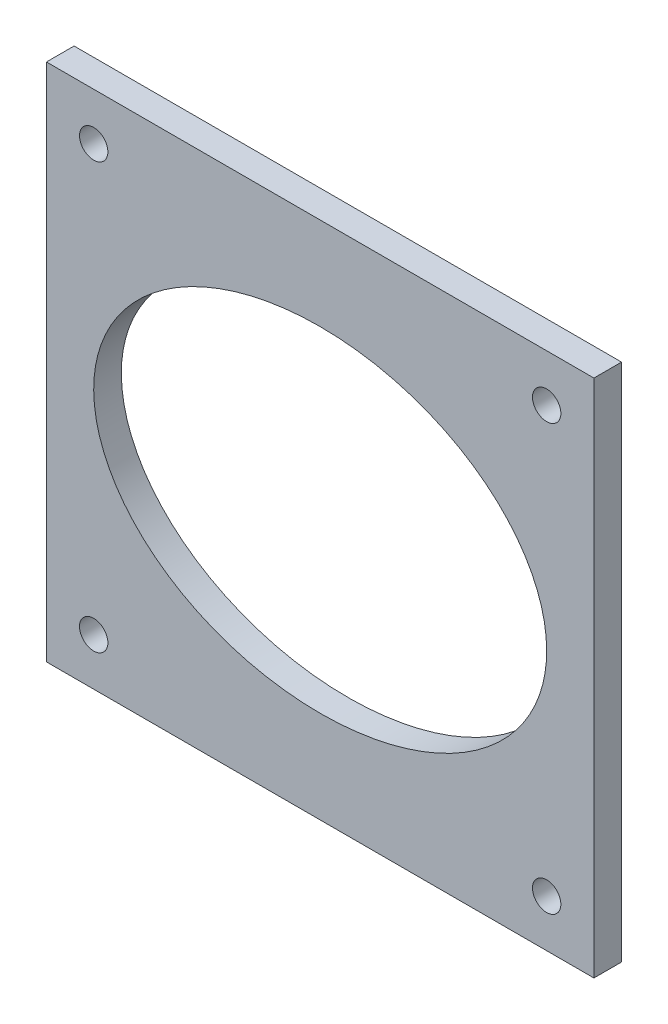
ISO-10303-21;
HEADER;
FILE_DESCRIPTION(('STEP AP214'),'2;1');
FILE_NAME('part.step','',(''),(''),'','','');
FILE_SCHEMA(('AUTOMOTIVE_DESIGN { 1 0 10303 214 1 1 1 1 }'));
ENDSEC;
DATA;
#1=APPLICATION_CONTEXT('core data for automotive mechanical design processes');
#2=APPLICATION_PROTOCOL_DEFINITION('international standard','automotive_design',2000,#1);
#3=PRODUCT_CONTEXT('',#1,'mechanical');
#4=PRODUCT('Part','Part','',(#3));
#5=PRODUCT_RELATED_PRODUCT_CATEGORY('part','',(#4));
#6=PRODUCT_DEFINITION_FORMATION('','',#4);
#7=PRODUCT_DEFINITION_CONTEXT('part definition',#1,'design');
#8=PRODUCT_DEFINITION('design','',#6,#7);
#9=PRODUCT_DEFINITION_SHAPE('','',#8);
#10=(LENGTH_UNIT() NAMED_UNIT(*) SI_UNIT(.MILLI.,.METRE.));
#11=(NAMED_UNIT(*) PLANE_ANGLE_UNIT() SI_UNIT($,.RADIAN.));
#12=(NAMED_UNIT(*) SI_UNIT($,.STERADIAN.) SOLID_ANGLE_UNIT());
#13=UNCERTAINTY_MEASURE_WITH_UNIT(LENGTH_MEASURE(1.E-05),#10,'distance_accuracy_value','');
#14=(GEOMETRIC_REPRESENTATION_CONTEXT(3) GLOBAL_UNCERTAINTY_ASSIGNED_CONTEXT((#13)) GLOBAL_UNIT_ASSIGNED_CONTEXT((#10,
#11,#12)) REPRESENTATION_CONTEXT('',''));
#15=CARTESIAN_POINT('',(0.,0.,0.));
#16=DIRECTION('',(0.,0.,1.));
#17=DIRECTION('',(1.,0.,0.));
#18=AXIS2_PLACEMENT_3D('',#15,#16,#17);
#19=CARTESIAN_POINT('',(0.,0.,5.85));
#20=DIRECTION('',(0.,0.,1.));
#21=DIRECTION('',(1.,0.,0.));
#22=AXIS2_PLACEMENT_3D('',#19,#20,#21);
#23=PLANE('',#22);
#24=CARTESIAN_POINT('',(47.95,-45.,5.85));
#25=DIRECTION('',(0.,0.,1.));
#26=DIRECTION('',(1.,0.,0.));
#27=AXIS2_PLACEMENT_3D('',#24,#25,#26);
#28=CIRCLE('',#27,3.00000000000001);
#29=CARTESIAN_POINT('',(50.95,-45.,5.85));
#30=VERTEX_POINT('',#29);
#31=EDGE_CURVE('E203',#30,#30,#28,.T.);
#32=ORIENTED_EDGE('',*,*,#31,.F.);
#33=EDGE_LOOP('',(#32));
#34=FACE_BOUND('',#33,.T.);
#35=CARTESIAN_POINT('',(-47.95,45.,5.85));
#36=DIRECTION('',(0.,0.,1.));
#37=DIRECTION('',(1.,0.,0.));
#38=AXIS2_PLACEMENT_3D('',#35,#36,#37);
#39=CIRCLE('',#38,3.00000000000001);
#40=CARTESIAN_POINT('',(-44.95,45.,5.85));
#41=VERTEX_POINT('',#40);
#42=EDGE_CURVE('E219',#41,#41,#39,.T.);
#43=ORIENTED_EDGE('',*,*,#42,.F.);
#44=EDGE_LOOP('',(#43));
#45=FACE_BOUND('',#44,.T.);
#46=DIRECTION('',(0.,-1.,0.));
#47=VECTOR('',#46,1.);
#48=CARTESIAN_POINT('',(-57.95,-55.,5.85));
#49=LINE('',#48,#47);
#50=CARTESIAN_POINT('',(-57.95,55.,5.85));
#51=VERTEX_POINT('',#50);
#52=CARTESIAN_POINT('',(-57.95,-55.,5.85));
#53=VERTEX_POINT('',#52);
#54=EDGE_CURVE('E97',#51,#53,#49,.T.);
#55=ORIENTED_EDGE('',*,*,#54,.T.);
#56=DIRECTION('',(1.,0.,0.));
#57=VECTOR('',#56,1.);
#58=CARTESIAN_POINT('',(57.95,-55.,5.85));
#59=LINE('',#58,#57);
#60=CARTESIAN_POINT('',(57.95,-55.,5.85));
#61=VERTEX_POINT('',#60);
#62=EDGE_CURVE('E92',#53,#61,#59,.T.);
#63=ORIENTED_EDGE('',*,*,#62,.T.);
#64=DIRECTION('',(0.,1.,0.));
#65=VECTOR('',#64,1.);
#66=CARTESIAN_POINT('',(57.95,-55.,5.85));
#67=LINE('',#66,#65);
#68=CARTESIAN_POINT('',(57.95,55.,5.85));
#69=VERTEX_POINT('',#68);
#70=EDGE_CURVE('E95',#61,#69,#67,.T.);
#71=ORIENTED_EDGE('',*,*,#70,.T.);
#72=DIRECTION('',(-1.,0.,0.));
#73=VECTOR('',#72,1.);
#74=CARTESIAN_POINT('',(57.95,55.,5.85));
#75=LINE('',#74,#73);
#76=EDGE_CURVE('E62',#69,#51,#75,.T.);
#77=ORIENTED_EDGE('',*,*,#76,.T.);
#78=EDGE_LOOP('',(#55,#63,#71,#77));
#79=FACE_BOUND('',#78,.T.);
#80=CARTESIAN_POINT('',(0.,0.,5.85));
#81=DIRECTION('',(0.,0.,1.));
#82=DIRECTION('',(1.,0.,0.));
#83=AXIS2_PLACEMENT_3D('',#80,#81,#82);
#84=ELLIPSE('',#83,47.95,35.45);
#85=CARTESIAN_POINT('',(47.95,0.,5.85));
#86=VERTEX_POINT('',#85);
#87=EDGE_CURVE('E145',#86,#86,#84,.T.);
#88=ORIENTED_EDGE('',*,*,#87,.F.);
#89=EDGE_LOOP('',(#88));
#90=FACE_BOUND('',#89,.T.);
#91=CARTESIAN_POINT('',(-47.95,-45.,5.85));
#92=DIRECTION('',(0.,0.,1.));
#93=DIRECTION('',(1.,0.,0.));
#94=AXIS2_PLACEMENT_3D('',#91,#92,#93);
#95=CIRCLE('',#94,3.00000000000001);
#96=CARTESIAN_POINT('',(-44.95,-45.,5.85));
#97=VERTEX_POINT('',#96);
#98=EDGE_CURVE('E193',#97,#97,#95,.T.);
#99=ORIENTED_EDGE('',*,*,#98,.F.);
#100=EDGE_LOOP('',(#99));
#101=FACE_BOUND('',#100,.T.);
#102=CARTESIAN_POINT('',(47.95,45.,5.85));
#103=DIRECTION('',(0.,0.,1.));
#104=DIRECTION('',(1.,0.,0.));
#105=AXIS2_PLACEMENT_3D('',#102,#103,#104);
#106=CIRCLE('',#105,3.00000000000001);
#107=CARTESIAN_POINT('',(50.95,45.,5.85));
#108=VERTEX_POINT('',#107);
#109=EDGE_CURVE('E211',#108,#108,#106,.T.);
#110=ORIENTED_EDGE('',*,*,#109,.F.);
#111=EDGE_LOOP('',(#110));
#112=FACE_BOUND('',#111,.T.);
#113=ADVANCED_FACE('F43',(#34,#45,#79,#90,#101,#112),#23,.T.);
#114=CARTESIAN_POINT('',(0.,0.,0.));
#115=DIRECTION('',(0.,0.,1.));
#116=DIRECTION('',(1.,0.,0.));
#117=AXIS2_PLACEMENT_3D('',#114,#115,#116);
#118=PLANE('',#117);
#119=DIRECTION('',(0.,-1.,0.));
#120=VECTOR('',#119,1.);
#121=CARTESIAN_POINT('',(-57.95,-55.,0.));
#122=LINE('',#121,#120);
#123=CARTESIAN_POINT('',(-57.95,55.,0.));
#124=VERTEX_POINT('',#123);
#125=CARTESIAN_POINT('',(-57.95,-55.,0.));
#126=VERTEX_POINT('',#125);
#127=EDGE_CURVE('E141',#124,#126,#122,.T.);
#128=ORIENTED_EDGE('',*,*,#127,.F.);
#129=DIRECTION('',(-1.,0.,0.));
#130=VECTOR('',#129,1.);
#131=CARTESIAN_POINT('',(57.95,55.,0.));
#132=LINE('',#131,#130);
#133=CARTESIAN_POINT('',(57.95,55.,0.));
#134=VERTEX_POINT('',#133);
#135=EDGE_CURVE('E85',#134,#124,#132,.T.);
#136=ORIENTED_EDGE('',*,*,#135,.F.);
#137=DIRECTION('',(0.,1.,0.));
#138=VECTOR('',#137,1.);
#139=CARTESIAN_POINT('',(57.95,-55.,0.));
#140=LINE('',#139,#138);
#141=CARTESIAN_POINT('',(57.95,-55.,0.));
#142=VERTEX_POINT('',#141);
#143=EDGE_CURVE('E79',#142,#134,#140,.T.);
#144=ORIENTED_EDGE('',*,*,#143,.F.);
#145=DIRECTION('',(1.,0.,0.));
#146=VECTOR('',#145,1.);
#147=CARTESIAN_POINT('',(57.95,-55.,0.));
#148=LINE('',#147,#146);
#149=EDGE_CURVE('E102',#126,#142,#148,.T.);
#150=ORIENTED_EDGE('',*,*,#149,.F.);
#151=EDGE_LOOP('',(#128,#136,#144,#150));
#152=FACE_BOUND('',#151,.T.);
#153=CARTESIAN_POINT('',(0.,0.,0.));
#154=DIRECTION('',(0.,0.,1.));
#155=DIRECTION('',(1.,0.,0.));
#156=AXIS2_PLACEMENT_3D('',#153,#154,#155);
#157=ELLIPSE('',#156,47.95,35.45);
#158=CARTESIAN_POINT('',(47.95,0.,0.));
#159=VERTEX_POINT('',#158);
#160=EDGE_CURVE('E224',#159,#159,#157,.T.);
#161=ORIENTED_EDGE('',*,*,#160,.T.);
#162=EDGE_LOOP('',(#161));
#163=FACE_BOUND('',#162,.T.);
#164=CARTESIAN_POINT('',(-47.95,45.,0.));
#165=DIRECTION('',(0.,0.,1.));
#166=DIRECTION('',(1.,0.,0.));
#167=AXIS2_PLACEMENT_3D('',#164,#165,#166);
#168=CIRCLE('',#167,3.00000000000001);
#169=CARTESIAN_POINT('',(-44.95,45.,0.));
#170=VERTEX_POINT('',#169);
#171=EDGE_CURVE('E198',#170,#170,#168,.T.);
#172=ORIENTED_EDGE('',*,*,#171,.T.);
#173=EDGE_LOOP('',(#172));
#174=FACE_BOUND('',#173,.T.);
#175=CARTESIAN_POINT('',(-47.95,-45.,0.));
#176=DIRECTION('',(0.,0.,1.));
#177=DIRECTION('',(1.,0.,0.));
#178=AXIS2_PLACEMENT_3D('',#175,#176,#177);
#179=CIRCLE('',#178,3.00000000000001);
#180=CARTESIAN_POINT('',(-44.95,-45.,0.));
#181=VERTEX_POINT('',#180);
#182=EDGE_CURVE('E199',#181,#181,#179,.T.);
#183=ORIENTED_EDGE('',*,*,#182,.T.);
#184=EDGE_LOOP('',(#183));
#185=FACE_BOUND('',#184,.T.);
#186=CARTESIAN_POINT('',(47.95,-45.,0.));
#187=DIRECTION('',(0.,0.,1.));
#188=DIRECTION('',(1.,0.,0.));
#189=AXIS2_PLACEMENT_3D('',#186,#187,#188);
#190=CIRCLE('',#189,3.00000000000001);
#191=CARTESIAN_POINT('',(50.95,-45.,0.));
#192=VERTEX_POINT('',#191);
#193=EDGE_CURVE('E208',#192,#192,#190,.T.);
#194=ORIENTED_EDGE('',*,*,#193,.T.);
#195=EDGE_LOOP('',(#194));
#196=FACE_BOUND('',#195,.T.);
#197=CARTESIAN_POINT('',(47.95,45.,0.));
#198=DIRECTION('',(0.,0.,1.));
#199=DIRECTION('',(1.,0.,0.));
#200=AXIS2_PLACEMENT_3D('',#197,#198,#199);
#201=CIRCLE('',#200,3.00000000000001);
#202=CARTESIAN_POINT('',(50.95,45.,0.));
#203=VERTEX_POINT('',#202);
#204=EDGE_CURVE('E216',#203,#203,#201,.T.);
#205=ORIENTED_EDGE('',*,*,#204,.T.);
#206=EDGE_LOOP('',(#205));
#207=FACE_BOUND('',#206,.T.);
#208=ADVANCED_FACE('F176',(#152,#163,#174,#185,#196,#207),#118,.F.);
#209=CARTESIAN_POINT('',(-57.95,-55.,5.85));
#210=DIRECTION('',(1.,0.,0.));
#211=DIRECTION('',(0.,0.,-1.));
#212=AXIS2_PLACEMENT_3D('',#209,#210,#211);
#213=PLANE('',#212);
#214=ORIENTED_EDGE('',*,*,#127,.T.);
#215=DIRECTION('',(0.,0.,-1.));
#216=VECTOR('',#215,1.);
#217=CARTESIAN_POINT('',(-57.95,-55.,5.85));
#218=LINE('',#217,#216);
#219=EDGE_CURVE('E12',#53,#126,#218,.T.);
#220=ORIENTED_EDGE('',*,*,#219,.F.);
#221=ORIENTED_EDGE('',*,*,#54,.F.);
#222=DIRECTION('',(0.,0.,-1.));
#223=VECTOR('',#222,1.);
#224=CARTESIAN_POINT('',(-57.95,55.,5.85));
#225=LINE('',#224,#223);
#226=EDGE_CURVE('E109',#51,#124,#225,.T.);
#227=ORIENTED_EDGE('',*,*,#226,.T.);
#228=EDGE_LOOP('',(#214,#220,#221,#227));
#229=FACE_BOUND('',#228,.T.);
#230=ADVANCED_FACE('F45',(#229),#213,.F.);
#231=CARTESIAN_POINT('',(57.95,-55.,5.85));
#232=DIRECTION('',(0.,1.,0.));
#233=DIRECTION('',(0.,0.,1.));
#234=AXIS2_PLACEMENT_3D('',#231,#232,#233);
#235=PLANE('',#234);
#236=ORIENTED_EDGE('',*,*,#149,.T.);
#237=DIRECTION('',(0.,0.,-1.));
#238=VECTOR('',#237,1.);
#239=CARTESIAN_POINT('',(57.95,-55.,5.85));
#240=LINE('',#239,#238);
#241=EDGE_CURVE('E54',#61,#142,#240,.T.);
#242=ORIENTED_EDGE('',*,*,#241,.F.);
#243=ORIENTED_EDGE('',*,*,#62,.F.);
#244=ORIENTED_EDGE('',*,*,#219,.T.);
#245=EDGE_LOOP('',(#236,#242,#243,#244));
#246=FACE_BOUND('',#245,.T.);
#247=ADVANCED_FACE('F101',(#246),#235,.F.);
#248=CARTESIAN_POINT('',(57.95,-55.,5.85));
#249=DIRECTION('',(-1.,0.,0.));
#250=DIRECTION('',(0.,0.,1.));
#251=AXIS2_PLACEMENT_3D('',#248,#249,#250);
#252=PLANE('',#251);
#253=ORIENTED_EDGE('',*,*,#143,.T.);
#254=DIRECTION('',(0.,0.,-1.));
#255=VECTOR('',#254,1.);
#256=CARTESIAN_POINT('',(57.95,55.,5.85));
#257=LINE('',#256,#255);
#258=EDGE_CURVE('E104',#69,#134,#257,.T.);
#259=ORIENTED_EDGE('',*,*,#258,.F.);
#260=ORIENTED_EDGE('',*,*,#70,.F.);
#261=ORIENTED_EDGE('',*,*,#241,.T.);
#262=EDGE_LOOP('',(#253,#259,#260,#261));
#263=FACE_BOUND('',#262,.T.);
#264=ADVANCED_FACE('F105',(#263),#252,.F.);
#265=CARTESIAN_POINT('',(57.95,55.,5.85));
#266=DIRECTION('',(0.,-1.,0.));
#267=DIRECTION('',(0.,0.,-1.));
#268=AXIS2_PLACEMENT_3D('',#265,#266,#267);
#269=PLANE('',#268);
#270=ORIENTED_EDGE('',*,*,#135,.T.);
#271=ORIENTED_EDGE('',*,*,#226,.F.);
#272=ORIENTED_EDGE('',*,*,#76,.F.);
#273=ORIENTED_EDGE('',*,*,#258,.T.);
#274=EDGE_LOOP('',(#270,#271,#272,#273));
#275=FACE_BOUND('',#274,.T.);
#276=ADVANCED_FACE('F160',(#275),#269,.F.);
#277=DIRECTION('',(0.,0.,-1.));
#278=VECTOR('',#277,1.);
#279=SURFACE_OF_LINEAR_EXTRUSION('',#84,#278);
#280=ORIENTED_EDGE('',*,*,#87,.T.);
#281=EDGE_LOOP('',(#280));
#282=FACE_BOUND('',#281,.T.);
#283=ORIENTED_EDGE('',*,*,#160,.F.);
#284=EDGE_LOOP('',(#283));
#285=FACE_BOUND('',#284,.T.);
#286=ADVANCED_FACE('F165',(#282,#285),#279,.T.);
#287=CARTESIAN_POINT('',(-47.95,45.,5.85));
#288=DIRECTION('',(0.,0.,-1.));
#289=DIRECTION('',(-1.,0.,0.));
#290=AXIS2_PLACEMENT_3D('',#287,#288,#289);
#291=CYLINDRICAL_SURFACE('',#290,3.00000000000001);
#292=ORIENTED_EDGE('',*,*,#42,.T.);
#293=EDGE_LOOP('',(#292));
#294=FACE_BOUND('',#293,.T.);
#295=ORIENTED_EDGE('',*,*,#171,.F.);
#296=EDGE_LOOP('',(#295));
#297=FACE_BOUND('',#296,.T.);
#298=ADVANCED_FACE('F234',(#294,#297),#291,.F.);
#299=CARTESIAN_POINT('',(-47.95,-45.,5.85));
#300=DIRECTION('',(0.,0.,-1.));
#301=DIRECTION('',(-1.,0.,0.));
#302=AXIS2_PLACEMENT_3D('',#299,#300,#301);
#303=CYLINDRICAL_SURFACE('',#302,3.00000000000001);
#304=ORIENTED_EDGE('',*,*,#98,.T.);
#305=EDGE_LOOP('',(#304));
#306=FACE_BOUND('',#305,.T.);
#307=ORIENTED_EDGE('',*,*,#182,.F.);
#308=EDGE_LOOP('',(#307));
#309=FACE_BOUND('',#308,.T.);
#310=ADVANCED_FACE('F262',(#306,#309),#303,.F.);
#311=CARTESIAN_POINT('',(47.95,-45.,5.85));
#312=DIRECTION('',(0.,0.,-1.));
#313=DIRECTION('',(-1.,0.,0.));
#314=AXIS2_PLACEMENT_3D('',#311,#312,#313);
#315=CYLINDRICAL_SURFACE('',#314,3.00000000000001);
#316=ORIENTED_EDGE('',*,*,#31,.T.);
#317=EDGE_LOOP('',(#316));
#318=FACE_BOUND('',#317,.T.);
#319=ORIENTED_EDGE('',*,*,#193,.F.);
#320=EDGE_LOOP('',(#319));
#321=FACE_BOUND('',#320,.T.);
#322=ADVANCED_FACE('F252',(#318,#321),#315,.F.);
#323=CARTESIAN_POINT('',(47.95,45.,5.85));
#324=DIRECTION('',(0.,0.,-1.));
#325=DIRECTION('',(-1.,0.,0.));
#326=AXIS2_PLACEMENT_3D('',#323,#324,#325);
#327=CYLINDRICAL_SURFACE('',#326,3.00000000000001);
#328=ORIENTED_EDGE('',*,*,#109,.T.);
#329=EDGE_LOOP('',(#328));
#330=FACE_BOUND('',#329,.T.);
#331=ORIENTED_EDGE('',*,*,#204,.F.);
#332=EDGE_LOOP('',(#331));
#333=FACE_BOUND('',#332,.T.);
#334=ADVANCED_FACE('F246',(#330,#333),#327,.F.);
#335=CLOSED_SHELL('',(#113,#208,#230,#247,#264,#276,#286,#298,#310,#322,#334));
#336=MANIFOLD_SOLID_BREP('B2',#335);
#337=ADVANCED_BREP_SHAPE_REPRESENTATION('',(#18,#336),#14);
#338=SHAPE_DEFINITION_REPRESENTATION(#9,#337);
ENDSEC;
END-ISO-10303-21;
